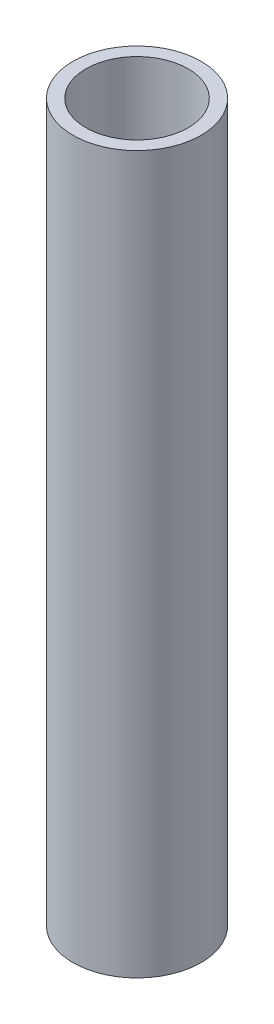
ISO-10303-21;
HEADER;
FILE_DESCRIPTION(('STEP AP214'),'2;1');
FILE_NAME('part.step','',(''),(''),'','','');
FILE_SCHEMA(('AUTOMOTIVE_DESIGN { 1 0 10303 214 1 1 1 1 }'));
ENDSEC;
DATA;
#1=APPLICATION_CONTEXT('core data for automotive mechanical design processes');
#2=APPLICATION_PROTOCOL_DEFINITION('international standard','automotive_design',2000,#1);
#3=PRODUCT_CONTEXT('',#1,'mechanical');
#4=PRODUCT('Part','Part','',(#3));
#5=PRODUCT_RELATED_PRODUCT_CATEGORY('part','',(#4));
#6=PRODUCT_DEFINITION_FORMATION('','',#4);
#7=PRODUCT_DEFINITION_CONTEXT('part definition',#1,'design');
#8=PRODUCT_DEFINITION('design','',#6,#7);
#9=PRODUCT_DEFINITION_SHAPE('','',#8);
#10=(LENGTH_UNIT() NAMED_UNIT(*) SI_UNIT(.MILLI.,.METRE.));
#11=(NAMED_UNIT(*) PLANE_ANGLE_UNIT() SI_UNIT($,.RADIAN.));
#12=(NAMED_UNIT(*) SI_UNIT($,.STERADIAN.) SOLID_ANGLE_UNIT());
#13=UNCERTAINTY_MEASURE_WITH_UNIT(LENGTH_MEASURE(1.E-05),#10,'distance_accuracy_value','');
#14=(GEOMETRIC_REPRESENTATION_CONTEXT(3) GLOBAL_UNCERTAINTY_ASSIGNED_CONTEXT((#13)) GLOBAL_UNIT_ASSIGNED_CONTEXT((#10,
#11,#12)) REPRESENTATION_CONTEXT('',''));
#15=CARTESIAN_POINT('',(0.,0.,0.));
#16=DIRECTION('',(0.,0.,1.));
#17=DIRECTION('',(1.,0.,0.));
#18=AXIS2_PLACEMENT_3D('',#15,#16,#17);
#19=CARTESIAN_POINT('',(0.,186.69,0.));
#20=DIRECTION('',(0.,1.,0.));
#21=DIRECTION('',(0.,0.,1.));
#22=AXIS2_PLACEMENT_3D('',#19,#20,#21);
#23=PLANE('',#22);
#24=CARTESIAN_POINT('',(0.,186.69,0.));
#25=DIRECTION('',(0.,1.,0.));
#26=DIRECTION('',(0.,0.,1.));
#27=AXIS2_PLACEMENT_3D('',#24,#25,#26);
#28=CIRCLE('',#27,16.7005);
#29=CARTESIAN_POINT('',(0.,186.69,-16.7005));
#30=VERTEX_POINT('',#29);
#31=EDGE_CURVE('E10',#30,#30,#28,.T.);
#32=ORIENTED_EDGE('',*,*,#31,.T.);
#33=EDGE_LOOP('',(#32));
#34=FACE_BOUND('',#33,.T.);
#35=CARTESIAN_POINT('',(0.,186.69,0.));
#36=DIRECTION('',(0.,1.,0.));
#37=DIRECTION('',(0.,0.,1.));
#38=AXIS2_PLACEMENT_3D('',#35,#36,#37);
#39=CIRCLE('',#38,13.3223);
#40=CARTESIAN_POINT('',(0.,186.69,-13.3223));
#41=VERTEX_POINT('',#40);
#42=EDGE_CURVE('E39',#41,#41,#39,.T.);
#43=ORIENTED_EDGE('',*,*,#42,.F.);
#44=EDGE_LOOP('',(#43));
#45=FACE_BOUND('',#44,.T.);
#46=ADVANCED_FACE('F28',(#34,#45),#23,.T.);
#47=CARTESIAN_POINT('',(0.,0.,0.));
#48=DIRECTION('',(0.,1.,0.));
#49=DIRECTION('',(0.,0.,1.));
#50=AXIS2_PLACEMENT_3D('',#47,#48,#49);
#51=PLANE('',#50);
#52=CARTESIAN_POINT('',(0.,0.,0.));
#53=DIRECTION('',(0.,1.,0.));
#54=DIRECTION('',(0.,0.,1.));
#55=AXIS2_PLACEMENT_3D('',#52,#53,#54);
#56=CIRCLE('',#55,16.7005);
#57=CARTESIAN_POINT('',(0.,0.,-16.7005));
#58=VERTEX_POINT('',#57);
#59=EDGE_CURVE('E32',#58,#58,#56,.T.);
#60=ORIENTED_EDGE('',*,*,#59,.F.);
#61=EDGE_LOOP('',(#60));
#62=FACE_BOUND('',#61,.T.);
#63=CARTESIAN_POINT('',(0.,0.,0.));
#64=DIRECTION('',(0.,1.,0.));
#65=DIRECTION('',(0.,0.,1.));
#66=AXIS2_PLACEMENT_3D('',#63,#64,#65);
#67=CIRCLE('',#66,13.3223);
#68=CARTESIAN_POINT('',(0.,0.,-13.3223));
#69=VERTEX_POINT('',#68);
#70=EDGE_CURVE('E41',#69,#69,#67,.T.);
#71=ORIENTED_EDGE('',*,*,#70,.T.);
#72=EDGE_LOOP('',(#71));
#73=FACE_BOUND('',#72,.T.);
#74=ADVANCED_FACE('F51',(#62,#73),#51,.F.);
#75=CARTESIAN_POINT('',(0.,186.69,0.));
#76=DIRECTION('',(0.,-1.,0.));
#77=DIRECTION('',(0.,0.,-1.));
#78=AXIS2_PLACEMENT_3D('',#75,#76,#77);
#79=CYLINDRICAL_SURFACE('',#78,16.7005);
#80=CARTESIAN_POINT('',(0.,186.69,-16.7005));
#81=CARTESIAN_POINT('',(0.,184.7453125,-16.7005));
#82=CARTESIAN_POINT('',(0.,182.800625,-16.7005));
#83=CARTESIAN_POINT('',(0.,178.91125,-16.7005));
#84=CARTESIAN_POINT('',(0.,176.9665625,-16.7005));
#85=CARTESIAN_POINT('',(0.,173.0771875,-16.7005));
#86=CARTESIAN_POINT('',(0.,171.1325,-16.7005));
#87=CARTESIAN_POINT('',(0.,167.243125,-16.7005));
#88=CARTESIAN_POINT('',(0.,165.2984375,-16.7005));
#89=CARTESIAN_POINT('',(0.,161.4090625,-16.7005));
#90=CARTESIAN_POINT('',(0.,159.464375,-16.7005));
#91=CARTESIAN_POINT('',(0.,155.575,-16.7005));
#92=CARTESIAN_POINT('',(0.,153.6303125,-16.7005));
#93=CARTESIAN_POINT('',(0.,149.7409375,-16.7005));
#94=CARTESIAN_POINT('',(0.,147.79625,-16.7005));
#95=CARTESIAN_POINT('',(0.,143.906875,-16.7005));
#96=CARTESIAN_POINT('',(0.,141.9621875,-16.7005));
#97=CARTESIAN_POINT('',(0.,138.0728125,-16.7005));
#98=CARTESIAN_POINT('',(0.,136.128125,-16.7005));
#99=CARTESIAN_POINT('',(0.,132.23875,-16.7005));
#100=CARTESIAN_POINT('',(0.,130.2940625,-16.7005));
#101=CARTESIAN_POINT('',(0.,126.4046875,-16.7005));
#102=CARTESIAN_POINT('',(0.,124.46,-16.7005));
#103=CARTESIAN_POINT('',(0.,120.570625,-16.7005));
#104=CARTESIAN_POINT('',(0.,118.6259375,-16.7005));
#105=CARTESIAN_POINT('',(0.,114.7365625,-16.7005));
#106=CARTESIAN_POINT('',(0.,112.791875,-16.7005));
#107=CARTESIAN_POINT('',(0.,108.9025,-16.7005));
#108=CARTESIAN_POINT('',(0.,106.9578125,-16.7005));
#109=CARTESIAN_POINT('',(0.,103.0684375,-16.7005));
#110=CARTESIAN_POINT('',(0.,101.12375,-16.7005));
#111=CARTESIAN_POINT('',(0.,97.234375,-16.7005));
#112=CARTESIAN_POINT('',(0.,95.2896875,-16.7005));
#113=CARTESIAN_POINT('',(0.,91.4003125,-16.7005));
#114=CARTESIAN_POINT('',(0.,89.455625,-16.7005));
#115=CARTESIAN_POINT('',(0.,85.56625,-16.7005));
#116=CARTESIAN_POINT('',(0.,83.6215625,-16.7005));
#117=CARTESIAN_POINT('',(0.,79.7321875,-16.7005));
#118=CARTESIAN_POINT('',(0.,77.7875,-16.7005));
#119=CARTESIAN_POINT('',(0.,73.898125,-16.7005));
#120=CARTESIAN_POINT('',(0.,71.9534375,-16.7005));
#121=CARTESIAN_POINT('',(0.,68.0640625,-16.7005));
#122=CARTESIAN_POINT('',(0.,66.119375,-16.7005));
#123=CARTESIAN_POINT('',(0.,62.23,-16.7005));
#124=CARTESIAN_POINT('',(0.,60.2853125,-16.7005));
#125=CARTESIAN_POINT('',(0.,56.3959375,-16.7005));
#126=CARTESIAN_POINT('',(0.,54.45125,-16.7005));
#127=CARTESIAN_POINT('',(0.,50.561875,-16.7005));
#128=CARTESIAN_POINT('',(0.,48.6171875,-16.7005));
#129=CARTESIAN_POINT('',(0.,44.7278125,-16.7005));
#130=CARTESIAN_POINT('',(0.,42.783125,-16.7005));
#131=CARTESIAN_POINT('',(0.,38.89375,-16.7005));
#132=CARTESIAN_POINT('',(0.,36.9490625,-16.7005));
#133=CARTESIAN_POINT('',(0.,33.0596875,-16.7005));
#134=CARTESIAN_POINT('',(0.,31.115,-16.7005));
#135=CARTESIAN_POINT('',(0.,27.225625,-16.7005));
#136=CARTESIAN_POINT('',(0.,25.2809375,-16.7005));
#137=CARTESIAN_POINT('',(0.,21.3915625,-16.7005));
#138=CARTESIAN_POINT('',(0.,19.446875,-16.7005));
#139=CARTESIAN_POINT('',(0.,15.5575,-16.7005));
#140=CARTESIAN_POINT('',(0.,13.6128125,-16.7005));
#141=CARTESIAN_POINT('',(0.,9.72343750000001,-16.7005));
#142=CARTESIAN_POINT('',(0.,7.77875000000001,-16.7005));
#143=CARTESIAN_POINT('',(0.,3.88937500000001,-16.7005));
#144=CARTESIAN_POINT('',(0.,1.9446875,-16.7005));
#145=CARTESIAN_POINT('',(0.,0.,-16.7005));
#146=B_SPLINE_CURVE_WITH_KNOTS('',3,(#80,#81,#82,#83,#84,#85,#86,#87,#88,#89,#90,#91,#92,#93,
#94,#95,#96,#97,#98,#99,#100,#101,#102,#103,#104,#105,#106,#107,#108,#109,#110,#111,#112,#113,
#114,#115,#116,#117,#118,#119,#120,#121,#122,#123,#124,#125,#126,#127,#128,#129,#130,#131,#132,
#133,#134,#135,#136,#137,#138,#139,#140,#141,#142,#143,#144,#145),.UNSPECIFIED.,.F.,.F.,(4,2,2,
2,2,2,2,2,2,2,2,2,2,2,2,2,2,2,2,2,2,2,2,2,2,2,2,2,2,2,2,2,4),(0.,5.83406250000001,11.668125,
17.5021875,23.33625,29.1703125,35.004375,40.8384375,46.6725,52.5065625,58.340625,64.1746875,
70.00875,75.8428125,81.676875,87.5109375,93.345,99.1790625,105.013125,110.8471875,116.68125,
122.5153125,128.349375,134.1834375,140.0175,145.8515625,151.685625,157.5196875,163.35375,
169.1878125,175.021875,180.8559375,186.69),.UNSPECIFIED.);
#147=EDGE_CURVE('BSEAM30',#30,#58,#146,.T.);
#148=ORIENTED_EDGE('',*,*,#31,.F.);
#149=ORIENTED_EDGE('',*,*,#59,.T.);
#150=ORIENTED_EDGE('',*,*,#147,.T.);
#151=ORIENTED_EDGE('',*,*,#147,.F.);
#152=EDGE_LOOP('',(#148,#150,#149,#151));
#153=FACE_BOUND('',#152,.T.);
#154=ADVANCED_FACE('F30',(#153),#79,.T.);
#155=CARTESIAN_POINT('',(0.,186.69,0.));
#156=DIRECTION('',(0.,-1.,0.));
#157=DIRECTION('',(0.,0.,-1.));
#158=AXIS2_PLACEMENT_3D('',#155,#156,#157);
#159=CYLINDRICAL_SURFACE('',#158,13.3223);
#160=CARTESIAN_POINT('',(0.,186.69,-13.3223));
#161=CARTESIAN_POINT('',(0.,184.7453125,-13.3223));
#162=CARTESIAN_POINT('',(0.,182.800625,-13.3223));
#163=CARTESIAN_POINT('',(0.,178.91125,-13.3223));
#164=CARTESIAN_POINT('',(0.,176.9665625,-13.3223));
#165=CARTESIAN_POINT('',(0.,173.0771875,-13.3223));
#166=CARTESIAN_POINT('',(0.,171.1325,-13.3223));
#167=CARTESIAN_POINT('',(0.,167.243125,-13.3223));
#168=CARTESIAN_POINT('',(0.,165.2984375,-13.3223));
#169=CARTESIAN_POINT('',(0.,161.4090625,-13.3223));
#170=CARTESIAN_POINT('',(0.,159.464375,-13.3223));
#171=CARTESIAN_POINT('',(0.,155.575,-13.3223));
#172=CARTESIAN_POINT('',(0.,153.6303125,-13.3223));
#173=CARTESIAN_POINT('',(0.,149.7409375,-13.3223));
#174=CARTESIAN_POINT('',(0.,147.79625,-13.3223));
#175=CARTESIAN_POINT('',(0.,143.906875,-13.3223));
#176=CARTESIAN_POINT('',(0.,141.9621875,-13.3223));
#177=CARTESIAN_POINT('',(0.,138.0728125,-13.3223));
#178=CARTESIAN_POINT('',(0.,136.128125,-13.3223));
#179=CARTESIAN_POINT('',(0.,132.23875,-13.3223));
#180=CARTESIAN_POINT('',(0.,130.2940625,-13.3223));
#181=CARTESIAN_POINT('',(0.,126.4046875,-13.3223));
#182=CARTESIAN_POINT('',(0.,124.46,-13.3223));
#183=CARTESIAN_POINT('',(0.,120.570625,-13.3223));
#184=CARTESIAN_POINT('',(0.,118.6259375,-13.3223));
#185=CARTESIAN_POINT('',(0.,114.7365625,-13.3223));
#186=CARTESIAN_POINT('',(0.,112.791875,-13.3223));
#187=CARTESIAN_POINT('',(0.,108.9025,-13.3223));
#188=CARTESIAN_POINT('',(0.,106.9578125,-13.3223));
#189=CARTESIAN_POINT('',(0.,103.0684375,-13.3223));
#190=CARTESIAN_POINT('',(0.,101.12375,-13.3223));
#191=CARTESIAN_POINT('',(0.,97.234375,-13.3223));
#192=CARTESIAN_POINT('',(0.,95.2896875,-13.3223));
#193=CARTESIAN_POINT('',(0.,91.4003125,-13.3223));
#194=CARTESIAN_POINT('',(0.,89.455625,-13.3223));
#195=CARTESIAN_POINT('',(0.,85.56625,-13.3223));
#196=CARTESIAN_POINT('',(0.,83.6215625,-13.3223));
#197=CARTESIAN_POINT('',(0.,79.7321875,-13.3223));
#198=CARTESIAN_POINT('',(0.,77.7875,-13.3223));
#199=CARTESIAN_POINT('',(0.,73.898125,-13.3223));
#200=CARTESIAN_POINT('',(0.,71.9534375,-13.3223));
#201=CARTESIAN_POINT('',(0.,68.0640625,-13.3223));
#202=CARTESIAN_POINT('',(0.,66.119375,-13.3223));
#203=CARTESIAN_POINT('',(0.,62.23,-13.3223));
#204=CARTESIAN_POINT('',(0.,60.2853125,-13.3223));
#205=CARTESIAN_POINT('',(0.,56.3959375,-13.3223));
#206=CARTESIAN_POINT('',(0.,54.45125,-13.3223));
#207=CARTESIAN_POINT('',(0.,50.561875,-13.3223));
#208=CARTESIAN_POINT('',(0.,48.6171875,-13.3223));
#209=CARTESIAN_POINT('',(0.,44.7278125,-13.3223));
#210=CARTESIAN_POINT('',(0.,42.783125,-13.3223));
#211=CARTESIAN_POINT('',(0.,38.89375,-13.3223));
#212=CARTESIAN_POINT('',(0.,36.9490625,-13.3223));
#213=CARTESIAN_POINT('',(0.,33.0596875,-13.3223));
#214=CARTESIAN_POINT('',(0.,31.115,-13.3223));
#215=CARTESIAN_POINT('',(0.,27.225625,-13.3223));
#216=CARTESIAN_POINT('',(0.,25.2809375,-13.3223));
#217=CARTESIAN_POINT('',(0.,21.3915625,-13.3223));
#218=CARTESIAN_POINT('',(0.,19.446875,-13.3223));
#219=CARTESIAN_POINT('',(0.,15.5575,-13.3223));
#220=CARTESIAN_POINT('',(0.,13.6128125,-13.3223));
#221=CARTESIAN_POINT('',(0.,9.72343750000001,-13.3223));
#222=CARTESIAN_POINT('',(0.,7.77875000000001,-13.3223));
#223=CARTESIAN_POINT('',(0.,3.88937500000001,-13.3223));
#224=CARTESIAN_POINT('',(0.,1.9446875,-13.3223));
#225=CARTESIAN_POINT('',(0.,0.,-13.3223));
#226=B_SPLINE_CURVE_WITH_KNOTS('',3,(#160,#161,#162,#163,#164,#165,#166,#167,#168,#169,#170,
#171,#172,#173,#174,#175,#176,#177,#178,#179,#180,#181,#182,#183,#184,#185,#186,#187,#188,#189,
#190,#191,#192,#193,#194,#195,#196,#197,#198,#199,#200,#201,#202,#203,#204,#205,#206,#207,#208,
#209,#210,#211,#212,#213,#214,#215,#216,#217,#218,#219,#220,#221,#222,#223,#224,#225),
.UNSPECIFIED.,.F.,.F.,(4,2,2,2,2,2,2,2,2,2,2,2,2,2,2,2,2,2,2,2,2,2,2,2,2,2,2,2,2,2,2,2,4),(0.,
5.83406250000001,11.668125,17.5021875,23.33625,29.1703125,35.004375,40.8384375,46.6725,
52.5065625,58.340625,64.1746875,70.00875,75.8428125,81.676875,87.5109375,93.345,99.1790625,
105.013125,110.8471875,116.68125,122.5153125,128.349375,134.1834375,140.0175,145.8515625,
151.685625,157.5196875,163.35375,169.1878125,175.021875,180.8559375,186.69),.UNSPECIFIED.);
#227=EDGE_CURVE('BSEAM47',#41,#69,#226,.T.);
#228=ORIENTED_EDGE('',*,*,#42,.T.);
#229=ORIENTED_EDGE('',*,*,#70,.F.);
#230=ORIENTED_EDGE('',*,*,#227,.T.);
#231=ORIENTED_EDGE('',*,*,#227,.F.);
#232=EDGE_LOOP('',(#228,#230,#229,#231));
#233=FACE_BOUND('',#232,.T.);
#234=ADVANCED_FACE('F47',(#233),#159,.F.);
#235=CLOSED_SHELL('',(#46,#74,#154,#234));
#236=MANIFOLD_SOLID_BREP('B2',#235);
#237=ADVANCED_BREP_SHAPE_REPRESENTATION('',(#18,#236),#14);
#238=SHAPE_DEFINITION_REPRESENTATION(#9,#237);
ENDSEC;
END-ISO-10303-21;
